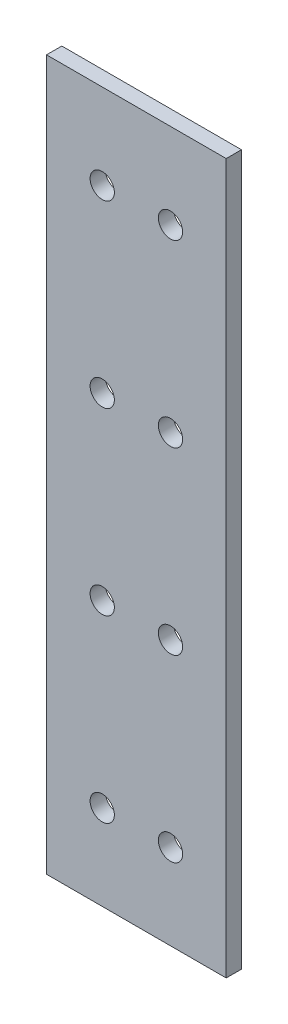
ISO-10303-21;
HEADER;
FILE_DESCRIPTION(('STEP AP214'),'2;1');
FILE_NAME('part.step','',(''),(''),'','','');
FILE_SCHEMA(('AUTOMOTIVE_DESIGN { 1 0 10303 214 1 1 1 1 }'));
ENDSEC;
DATA;
#1=APPLICATION_CONTEXT('core data for automotive mechanical design processes');
#2=APPLICATION_PROTOCOL_DEFINITION('international standard','automotive_design',2000,#1);
#3=PRODUCT_CONTEXT('',#1,'mechanical');
#4=PRODUCT('Part','Part','',(#3));
#5=PRODUCT_RELATED_PRODUCT_CATEGORY('part','',(#4));
#6=PRODUCT_DEFINITION_FORMATION('','',#4);
#7=PRODUCT_DEFINITION_CONTEXT('part definition',#1,'design');
#8=PRODUCT_DEFINITION('design','',#6,#7);
#9=PRODUCT_DEFINITION_SHAPE('','',#8);
#10=(LENGTH_UNIT() NAMED_UNIT(*) SI_UNIT(.MILLI.,.METRE.));
#11=(NAMED_UNIT(*) PLANE_ANGLE_UNIT() SI_UNIT($,.RADIAN.));
#12=(NAMED_UNIT(*) SI_UNIT($,.STERADIAN.) SOLID_ANGLE_UNIT());
#13=UNCERTAINTY_MEASURE_WITH_UNIT(LENGTH_MEASURE(1.E-05),#10,'distance_accuracy_value','');
#14=(GEOMETRIC_REPRESENTATION_CONTEXT(3) GLOBAL_UNCERTAINTY_ASSIGNED_CONTEXT((#13)) GLOBAL_UNIT_ASSIGNED_CONTEXT((#10,
#11,#12)) REPRESENTATION_CONTEXT('',''));
#15=CARTESIAN_POINT('',(0.,0.,0.));
#16=DIRECTION('',(0.,0.,1.));
#17=DIRECTION('',(1.,0.,0.));
#18=AXIS2_PLACEMENT_3D('',#15,#16,#17);
#19=CARTESIAN_POINT('',(10.,-39.5,1.7));
#20=DIRECTION('',(-1.,0.,0.));
#21=DIRECTION('',(0.,0.,1.));
#22=AXIS2_PLACEMENT_3D('',#19,#20,#21);
#23=PLANE('',#22);
#24=DIRECTION('',(0.,1.,0.));
#25=VECTOR('',#24,1.);
#26=CARTESIAN_POINT('',(10.,-39.5,0.));
#27=LINE('',#26,#25);
#28=CARTESIAN_POINT('',(10.,-39.5,0.));
#29=VERTEX_POINT('',#28);
#30=CARTESIAN_POINT('',(10.,39.5,0.));
#31=VERTEX_POINT('',#30);
#32=EDGE_CURVE('E96',#29,#31,#27,.T.);
#33=ORIENTED_EDGE('',*,*,#32,.T.);
#34=DIRECTION('',(0.,0.,-1.));
#35=VECTOR('',#34,1.);
#36=CARTESIAN_POINT('',(10.,39.5,1.7));
#37=LINE('',#36,#35);
#38=CARTESIAN_POINT('',(10.,39.5,1.7));
#39=VERTEX_POINT('',#38);
#40=EDGE_CURVE('E11',#39,#31,#37,.T.);
#41=ORIENTED_EDGE('',*,*,#40,.F.);
#42=DIRECTION('',(0.,1.,0.));
#43=VECTOR('',#42,1.);
#44=CARTESIAN_POINT('',(10.,-39.5,1.7));
#45=LINE('',#44,#43);
#46=CARTESIAN_POINT('',(10.,-39.5,1.7));
#47=VERTEX_POINT('',#46);
#48=EDGE_CURVE('E84',#47,#39,#45,.T.);
#49=ORIENTED_EDGE('',*,*,#48,.F.);
#50=DIRECTION('',(0.,0.,-1.));
#51=VECTOR('',#50,1.);
#52=CARTESIAN_POINT('',(10.,-39.5,1.7));
#53=LINE('',#52,#51);
#54=EDGE_CURVE('E92',#47,#29,#53,.T.);
#55=ORIENTED_EDGE('',*,*,#54,.T.);
#56=EDGE_LOOP('',(#33,#41,#49,#55));
#57=FACE_BOUND('',#56,.T.);
#58=ADVANCED_FACE('F33',(#57),#23,.F.);
#59=CARTESIAN_POINT('',(-10.,39.5,1.7));
#60=DIRECTION('',(0.,-1.,0.));
#61=DIRECTION('',(0.,0.,-1.));
#62=AXIS2_PLACEMENT_3D('',#59,#60,#61);
#63=PLANE('',#62);
#64=DIRECTION('',(-1.,0.,0.));
#65=VECTOR('',#64,1.);
#66=CARTESIAN_POINT('',(-10.,39.5,0.));
#67=LINE('',#66,#65);
#68=CARTESIAN_POINT('',(-10.,39.5,0.));
#69=VERTEX_POINT('',#68);
#70=EDGE_CURVE('E88',#31,#69,#67,.T.);
#71=ORIENTED_EDGE('',*,*,#70,.T.);
#72=DIRECTION('',(0.,0.,-1.));
#73=VECTOR('',#72,1.);
#74=CARTESIAN_POINT('',(-10.,39.5,1.7));
#75=LINE('',#74,#73);
#76=CARTESIAN_POINT('',(-10.,39.5,1.7));
#77=VERTEX_POINT('',#76);
#78=EDGE_CURVE('E41',#77,#69,#75,.T.);
#79=ORIENTED_EDGE('',*,*,#78,.F.);
#80=DIRECTION('',(-1.,0.,0.));
#81=VECTOR('',#80,1.);
#82=CARTESIAN_POINT('',(-10.,39.5,1.7));
#83=LINE('',#82,#81);
#84=EDGE_CURVE('E79',#39,#77,#83,.T.);
#85=ORIENTED_EDGE('',*,*,#84,.F.);
#86=ORIENTED_EDGE('',*,*,#40,.T.);
#87=EDGE_LOOP('',(#71,#79,#85,#86));
#88=FACE_BOUND('',#87,.T.);
#89=ADVANCED_FACE('F87',(#88),#63,.F.);
#90=CARTESIAN_POINT('',(-10.,-39.5,1.7));
#91=DIRECTION('',(1.,0.,0.));
#92=DIRECTION('',(0.,0.,-1.));
#93=AXIS2_PLACEMENT_3D('',#90,#91,#92);
#94=PLANE('',#93);
#95=DIRECTION('',(0.,-1.,0.));
#96=VECTOR('',#95,1.);
#97=CARTESIAN_POINT('',(-10.,-39.5,0.));
#98=LINE('',#97,#96);
#99=CARTESIAN_POINT('',(-10.,-39.5,0.));
#100=VERTEX_POINT('',#99);
#101=EDGE_CURVE('E66',#69,#100,#98,.T.);
#102=ORIENTED_EDGE('',*,*,#101,.T.);
#103=DIRECTION('',(0.,0.,-1.));
#104=VECTOR('',#103,1.);
#105=CARTESIAN_POINT('',(-10.,-39.5,1.7));
#106=LINE('',#105,#104);
#107=CARTESIAN_POINT('',(-10.,-39.5,1.7));
#108=VERTEX_POINT('',#107);
#109=EDGE_CURVE('E89',#108,#100,#106,.T.);
#110=ORIENTED_EDGE('',*,*,#109,.F.);
#111=DIRECTION('',(0.,-1.,0.));
#112=VECTOR('',#111,1.);
#113=CARTESIAN_POINT('',(-10.,-39.5,1.7));
#114=LINE('',#113,#112);
#115=EDGE_CURVE('E82',#77,#108,#114,.T.);
#116=ORIENTED_EDGE('',*,*,#115,.F.);
#117=ORIENTED_EDGE('',*,*,#78,.T.);
#118=EDGE_LOOP('',(#102,#110,#116,#117));
#119=FACE_BOUND('',#118,.T.);
#120=ADVANCED_FACE('F90',(#119),#94,.F.);
#121=CARTESIAN_POINT('',(-10.,-39.5,1.7));
#122=DIRECTION('',(0.,1.,0.));
#123=DIRECTION('',(0.,0.,1.));
#124=AXIS2_PLACEMENT_3D('',#121,#122,#123);
#125=PLANE('',#124);
#126=DIRECTION('',(1.,0.,0.));
#127=VECTOR('',#126,1.);
#128=CARTESIAN_POINT('',(-10.,-39.5,0.));
#129=LINE('',#128,#127);
#130=EDGE_CURVE('E72',#100,#29,#129,.T.);
#131=ORIENTED_EDGE('',*,*,#130,.T.);
#132=ORIENTED_EDGE('',*,*,#54,.F.);
#133=DIRECTION('',(1.,0.,0.));
#134=VECTOR('',#133,1.);
#135=CARTESIAN_POINT('',(-10.,-39.5,1.7));
#136=LINE('',#135,#134);
#137=EDGE_CURVE('E49',#108,#47,#136,.T.);
#138=ORIENTED_EDGE('',*,*,#137,.F.);
#139=ORIENTED_EDGE('',*,*,#109,.T.);
#140=EDGE_LOOP('',(#131,#132,#138,#139));
#141=FACE_BOUND('',#140,.T.);
#142=ADVANCED_FACE('F104',(#141),#125,.F.);
#143=CARTESIAN_POINT('',(0.,0.,1.7));
#144=DIRECTION('',(0.,0.,-1.));
#145=DIRECTION('',(-1.,0.,0.));
#146=AXIS2_PLACEMENT_3D('',#143,#144,#145);
#147=PLANE('',#146);
#148=CARTESIAN_POINT('',(-3.8,10.,1.7));
#149=DIRECTION('',(0.,0.,1.));
#150=DIRECTION('',(1.,0.,0.));
#151=AXIS2_PLACEMENT_3D('',#148,#149,#150);
#152=CIRCLE('',#151,1.35);
#153=CARTESIAN_POINT('',(-2.45,10.,1.7));
#154=VERTEX_POINT('',#153);
#155=EDGE_CURVE('E152',#154,#154,#152,.T.);
#156=ORIENTED_EDGE('',*,*,#155,.F.);
#157=EDGE_LOOP('',(#156));
#158=FACE_BOUND('',#157,.T.);
#159=CARTESIAN_POINT('',(-3.79999999999999,-10.,1.7));
#160=DIRECTION('',(0.,0.,1.));
#161=DIRECTION('',(1.,0.,0.));
#162=AXIS2_PLACEMENT_3D('',#159,#160,#161);
#163=CIRCLE('',#162,1.35);
#164=CARTESIAN_POINT('',(-2.44999999999999,-10.,1.7));
#165=VERTEX_POINT('',#164);
#166=EDGE_CURVE('E146',#165,#165,#163,.T.);
#167=ORIENTED_EDGE('',*,*,#166,.F.);
#168=EDGE_LOOP('',(#167));
#169=FACE_BOUND('',#168,.T.);
#170=CARTESIAN_POINT('',(-3.79999999999999,-30.,1.7));
#171=DIRECTION('',(0.,0.,1.));
#172=DIRECTION('',(1.,0.,0.));
#173=AXIS2_PLACEMENT_3D('',#170,#171,#172);
#174=CIRCLE('',#173,1.35);
#175=CARTESIAN_POINT('',(-2.44999999999999,-30.,1.7));
#176=VERTEX_POINT('',#175);
#177=EDGE_CURVE('E140',#176,#176,#174,.T.);
#178=ORIENTED_EDGE('',*,*,#177,.F.);
#179=EDGE_LOOP('',(#178));
#180=FACE_BOUND('',#179,.T.);
#181=CARTESIAN_POINT('',(3.79999999999999,-30.,1.7));
#182=DIRECTION('',(0.,0.,1.));
#183=DIRECTION('',(-1.,0.,0.));
#184=AXIS2_PLACEMENT_3D('',#181,#182,#183);
#185=CIRCLE('',#184,1.35);
#186=CARTESIAN_POINT('',(2.45,-30.,1.7));
#187=VERTEX_POINT('',#186);
#188=EDGE_CURVE('E134',#187,#187,#185,.T.);
#189=ORIENTED_EDGE('',*,*,#188,.F.);
#190=EDGE_LOOP('',(#189));
#191=FACE_BOUND('',#190,.T.);
#192=CARTESIAN_POINT('',(3.8,-10.,1.7));
#193=DIRECTION('',(0.,0.,1.));
#194=DIRECTION('',(-1.,0.,0.));
#195=AXIS2_PLACEMENT_3D('',#192,#193,#194);
#196=CIRCLE('',#195,1.35);
#197=CARTESIAN_POINT('',(2.45,-10.,1.7));
#198=VERTEX_POINT('',#197);
#199=EDGE_CURVE('E128',#198,#198,#196,.T.);
#200=ORIENTED_EDGE('',*,*,#199,.F.);
#201=EDGE_LOOP('',(#200));
#202=FACE_BOUND('',#201,.T.);
#203=CARTESIAN_POINT('',(3.8,10.,1.7));
#204=DIRECTION('',(0.,0.,1.));
#205=DIRECTION('',(-1.,0.,0.));
#206=AXIS2_PLACEMENT_3D('',#203,#204,#205);
#207=CIRCLE('',#206,1.35);
#208=CARTESIAN_POINT('',(2.45,10.,1.7));
#209=VERTEX_POINT('',#208);
#210=EDGE_CURVE('E122',#209,#209,#207,.T.);
#211=ORIENTED_EDGE('',*,*,#210,.F.);
#212=EDGE_LOOP('',(#211));
#213=FACE_BOUND('',#212,.T.);
#214=CARTESIAN_POINT('',(3.8,30.,1.7));
#215=DIRECTION('',(0.,0.,1.));
#216=DIRECTION('',(-1.,0.,0.));
#217=AXIS2_PLACEMENT_3D('',#214,#215,#216);
#218=CIRCLE('',#217,1.35);
#219=CARTESIAN_POINT('',(2.45,30.,1.7));
#220=VERTEX_POINT('',#219);
#221=EDGE_CURVE('E116',#220,#220,#218,.T.);
#222=ORIENTED_EDGE('',*,*,#221,.F.);
#223=EDGE_LOOP('',(#222));
#224=FACE_BOUND('',#223,.T.);
#225=CARTESIAN_POINT('',(-3.8,30.,1.7));
#226=DIRECTION('',(0.,0.,1.));
#227=DIRECTION('',(1.,0.,0.));
#228=AXIS2_PLACEMENT_3D('',#225,#226,#227);
#229=CIRCLE('',#228,1.35);
#230=CARTESIAN_POINT('',(-2.45,30.,1.7));
#231=VERTEX_POINT('',#230);
#232=EDGE_CURVE('E110',#231,#231,#229,.T.);
#233=ORIENTED_EDGE('',*,*,#232,.F.);
#234=EDGE_LOOP('',(#233));
#235=FACE_BOUND('',#234,.T.);
#236=ORIENTED_EDGE('',*,*,#48,.T.);
#237=ORIENTED_EDGE('',*,*,#84,.T.);
#238=ORIENTED_EDGE('',*,*,#115,.T.);
#239=ORIENTED_EDGE('',*,*,#137,.T.);
#240=EDGE_LOOP('',(#236,#237,#238,#239));
#241=FACE_BOUND('',#240,.T.);
#242=ADVANCED_FACE('F80',(#158,#169,#180,#191,#202,#213,#224,#235,#241),#147,.F.);
#243=CARTESIAN_POINT('',(0.,0.,0.));
#244=DIRECTION('',(0.,0.,-1.));
#245=DIRECTION('',(-1.,0.,0.));
#246=AXIS2_PLACEMENT_3D('',#243,#244,#245);
#247=PLANE('',#246);
#248=CARTESIAN_POINT('',(-3.8,10.,0.));
#249=DIRECTION('',(0.,0.,1.));
#250=DIRECTION('',(1.,0.,0.));
#251=AXIS2_PLACEMENT_3D('',#248,#249,#250);
#252=CIRCLE('',#251,1.35);
#253=CARTESIAN_POINT('',(-2.45,10.,0.));
#254=VERTEX_POINT('',#253);
#255=EDGE_CURVE('E113',#254,#254,#252,.T.);
#256=ORIENTED_EDGE('',*,*,#255,.T.);
#257=EDGE_LOOP('',(#256));
#258=FACE_BOUND('',#257,.T.);
#259=CARTESIAN_POINT('',(-3.79999999999999,-10.,0.));
#260=DIRECTION('',(0.,0.,1.));
#261=DIRECTION('',(1.,0.,0.));
#262=AXIS2_PLACEMENT_3D('',#259,#260,#261);
#263=CIRCLE('',#262,1.35);
#264=CARTESIAN_POINT('',(-2.44999999999999,-10.,0.));
#265=VERTEX_POINT('',#264);
#266=EDGE_CURVE('E149',#265,#265,#263,.T.);
#267=ORIENTED_EDGE('',*,*,#266,.T.);
#268=EDGE_LOOP('',(#267));
#269=FACE_BOUND('',#268,.T.);
#270=CARTESIAN_POINT('',(-3.79999999999999,-30.,0.));
#271=DIRECTION('',(0.,0.,1.));
#272=DIRECTION('',(1.,0.,0.));
#273=AXIS2_PLACEMENT_3D('',#270,#271,#272);
#274=CIRCLE('',#273,1.35);
#275=CARTESIAN_POINT('',(-2.44999999999999,-30.,0.));
#276=VERTEX_POINT('',#275);
#277=EDGE_CURVE('E143',#276,#276,#274,.T.);
#278=ORIENTED_EDGE('',*,*,#277,.T.);
#279=EDGE_LOOP('',(#278));
#280=FACE_BOUND('',#279,.T.);
#281=CARTESIAN_POINT('',(3.79999999999999,-30.,0.));
#282=DIRECTION('',(0.,0.,1.));
#283=DIRECTION('',(-1.,0.,0.));
#284=AXIS2_PLACEMENT_3D('',#281,#282,#283);
#285=CIRCLE('',#284,1.35);
#286=CARTESIAN_POINT('',(2.45,-30.,0.));
#287=VERTEX_POINT('',#286);
#288=EDGE_CURVE('E137',#287,#287,#285,.T.);
#289=ORIENTED_EDGE('',*,*,#288,.T.);
#290=EDGE_LOOP('',(#289));
#291=FACE_BOUND('',#290,.T.);
#292=CARTESIAN_POINT('',(3.8,-10.,0.));
#293=DIRECTION('',(0.,0.,1.));
#294=DIRECTION('',(-1.,0.,0.));
#295=AXIS2_PLACEMENT_3D('',#292,#293,#294);
#296=CIRCLE('',#295,1.35);
#297=CARTESIAN_POINT('',(2.45,-10.,0.));
#298=VERTEX_POINT('',#297);
#299=EDGE_CURVE('E131',#298,#298,#296,.T.);
#300=ORIENTED_EDGE('',*,*,#299,.T.);
#301=EDGE_LOOP('',(#300));
#302=FACE_BOUND('',#301,.T.);
#303=CARTESIAN_POINT('',(3.8,10.,0.));
#304=DIRECTION('',(0.,0.,1.));
#305=DIRECTION('',(-1.,0.,0.));
#306=AXIS2_PLACEMENT_3D('',#303,#304,#305);
#307=CIRCLE('',#306,1.35);
#308=CARTESIAN_POINT('',(2.45,10.,0.));
#309=VERTEX_POINT('',#308);
#310=EDGE_CURVE('E125',#309,#309,#307,.T.);
#311=ORIENTED_EDGE('',*,*,#310,.T.);
#312=EDGE_LOOP('',(#311));
#313=FACE_BOUND('',#312,.T.);
#314=CARTESIAN_POINT('',(3.8,30.,0.));
#315=DIRECTION('',(0.,0.,1.));
#316=DIRECTION('',(-1.,0.,0.));
#317=AXIS2_PLACEMENT_3D('',#314,#315,#316);
#318=CIRCLE('',#317,1.35);
#319=CARTESIAN_POINT('',(2.45,30.,0.));
#320=VERTEX_POINT('',#319);
#321=EDGE_CURVE('E119',#320,#320,#318,.T.);
#322=ORIENTED_EDGE('',*,*,#321,.T.);
#323=EDGE_LOOP('',(#322));
#324=FACE_BOUND('',#323,.T.);
#325=CARTESIAN_POINT('',(-3.8,30.,0.));
#326=DIRECTION('',(0.,0.,1.));
#327=DIRECTION('',(1.,0.,0.));
#328=AXIS2_PLACEMENT_3D('',#325,#326,#327);
#329=CIRCLE('',#328,1.35);
#330=CARTESIAN_POINT('',(-2.45,30.,0.));
#331=VERTEX_POINT('',#330);
#332=EDGE_CURVE('E99',#331,#331,#329,.T.);
#333=ORIENTED_EDGE('',*,*,#332,.T.);
#334=EDGE_LOOP('',(#333));
#335=FACE_BOUND('',#334,.T.);
#336=ORIENTED_EDGE('',*,*,#32,.F.);
#337=ORIENTED_EDGE('',*,*,#130,.F.);
#338=ORIENTED_EDGE('',*,*,#101,.F.);
#339=ORIENTED_EDGE('',*,*,#70,.F.);
#340=EDGE_LOOP('',(#336,#337,#338,#339));
#341=FACE_BOUND('',#340,.T.);
#342=ADVANCED_FACE('F107',(#258,#269,#280,#291,#302,#313,#324,#335,#341),#247,.T.);
#343=CARTESIAN_POINT('',(-3.8,30.,0.));
#344=DIRECTION('',(0.,0.,1.));
#345=DIRECTION('',(1.,0.,0.));
#346=AXIS2_PLACEMENT_3D('',#343,#344,#345);
#347=CYLINDRICAL_SURFACE('',#346,1.35);
#348=ORIENTED_EDGE('',*,*,#332,.F.);
#349=EDGE_LOOP('',(#348));
#350=FACE_BOUND('',#349,.T.);
#351=ORIENTED_EDGE('',*,*,#232,.T.);
#352=EDGE_LOOP('',(#351));
#353=FACE_BOUND('',#352,.T.);
#354=ADVANCED_FACE('F184',(#350,#353),#347,.F.);
#355=CARTESIAN_POINT('',(3.8,30.,0.));
#356=DIRECTION('',(0.,0.,1.));
#357=DIRECTION('',(1.,0.,0.));
#358=AXIS2_PLACEMENT_3D('',#355,#356,#357);
#359=CYLINDRICAL_SURFACE('',#358,1.35);
#360=ORIENTED_EDGE('',*,*,#321,.F.);
#361=EDGE_LOOP('',(#360));
#362=FACE_BOUND('',#361,.T.);
#363=ORIENTED_EDGE('',*,*,#221,.T.);
#364=EDGE_LOOP('',(#363));
#365=FACE_BOUND('',#364,.T.);
#366=ADVANCED_FACE('F186',(#362,#365),#359,.F.);
#367=CARTESIAN_POINT('',(3.8,10.,0.));
#368=DIRECTION('',(0.,0.,1.));
#369=DIRECTION('',(1.,0.,0.));
#370=AXIS2_PLACEMENT_3D('',#367,#368,#369);
#371=CYLINDRICAL_SURFACE('',#370,1.35);
#372=ORIENTED_EDGE('',*,*,#310,.F.);
#373=EDGE_LOOP('',(#372));
#374=FACE_BOUND('',#373,.T.);
#375=ORIENTED_EDGE('',*,*,#210,.T.);
#376=EDGE_LOOP('',(#375));
#377=FACE_BOUND('',#376,.T.);
#378=ADVANCED_FACE('F193',(#374,#377),#371,.F.);
#379=CARTESIAN_POINT('',(3.8,-10.,0.));
#380=DIRECTION('',(0.,0.,1.));
#381=DIRECTION('',(1.,0.,0.));
#382=AXIS2_PLACEMENT_3D('',#379,#380,#381);
#383=CYLINDRICAL_SURFACE('',#382,1.35);
#384=ORIENTED_EDGE('',*,*,#299,.F.);
#385=EDGE_LOOP('',(#384));
#386=FACE_BOUND('',#385,.T.);
#387=ORIENTED_EDGE('',*,*,#199,.T.);
#388=EDGE_LOOP('',(#387));
#389=FACE_BOUND('',#388,.T.);
#390=ADVANCED_FACE('F239',(#386,#389),#383,.F.);
#391=CARTESIAN_POINT('',(3.79999999999999,-30.,0.));
#392=DIRECTION('',(0.,0.,1.));
#393=DIRECTION('',(1.,0.,0.));
#394=AXIS2_PLACEMENT_3D('',#391,#392,#393);
#395=CYLINDRICAL_SURFACE('',#394,1.35);
#396=ORIENTED_EDGE('',*,*,#288,.F.);
#397=EDGE_LOOP('',(#396));
#398=FACE_BOUND('',#397,.T.);
#399=ORIENTED_EDGE('',*,*,#188,.T.);
#400=EDGE_LOOP('',(#399));
#401=FACE_BOUND('',#400,.T.);
#402=ADVANCED_FACE('F249',(#398,#401),#395,.F.);
#403=CARTESIAN_POINT('',(-3.79999999999999,-30.,0.));
#404=DIRECTION('',(0.,0.,1.));
#405=DIRECTION('',(1.,0.,0.));
#406=AXIS2_PLACEMENT_3D('',#403,#404,#405);
#407=CYLINDRICAL_SURFACE('',#406,1.35);
#408=ORIENTED_EDGE('',*,*,#277,.F.);
#409=EDGE_LOOP('',(#408));
#410=FACE_BOUND('',#409,.T.);
#411=ORIENTED_EDGE('',*,*,#177,.T.);
#412=EDGE_LOOP('',(#411));
#413=FACE_BOUND('',#412,.T.);
#414=ADVANCED_FACE('F259',(#410,#413),#407,.F.);
#415=CARTESIAN_POINT('',(-3.79999999999999,-10.,0.));
#416=DIRECTION('',(0.,0.,1.));
#417=DIRECTION('',(1.,0.,0.));
#418=AXIS2_PLACEMENT_3D('',#415,#416,#417);
#419=CYLINDRICAL_SURFACE('',#418,1.35);
#420=ORIENTED_EDGE('',*,*,#266,.F.);
#421=EDGE_LOOP('',(#420));
#422=FACE_BOUND('',#421,.T.);
#423=ORIENTED_EDGE('',*,*,#166,.T.);
#424=EDGE_LOOP('',(#423));
#425=FACE_BOUND('',#424,.T.);
#426=ADVANCED_FACE('F163',(#422,#425),#419,.F.);
#427=CARTESIAN_POINT('',(-3.8,10.,0.));
#428=DIRECTION('',(0.,0.,1.));
#429=DIRECTION('',(1.,0.,0.));
#430=AXIS2_PLACEMENT_3D('',#427,#428,#429);
#431=CYLINDRICAL_SURFACE('',#430,1.35);
#432=ORIENTED_EDGE('',*,*,#255,.F.);
#433=EDGE_LOOP('',(#432));
#434=FACE_BOUND('',#433,.T.);
#435=ORIENTED_EDGE('',*,*,#155,.T.);
#436=EDGE_LOOP('',(#435));
#437=FACE_BOUND('',#436,.T.);
#438=ADVANCED_FACE('F160',(#434,#437),#431,.F.);
#439=CLOSED_SHELL('',(#58,#89,#120,#142,#242,#342,#354,#366,#378,#390,#402,#414,#426,#438));
#440=MANIFOLD_SOLID_BREP('B2',#439);
#441=ADVANCED_BREP_SHAPE_REPRESENTATION('',(#18,#440),#14);
#442=SHAPE_DEFINITION_REPRESENTATION(#9,#441);
ENDSEC;
END-ISO-10303-21;
